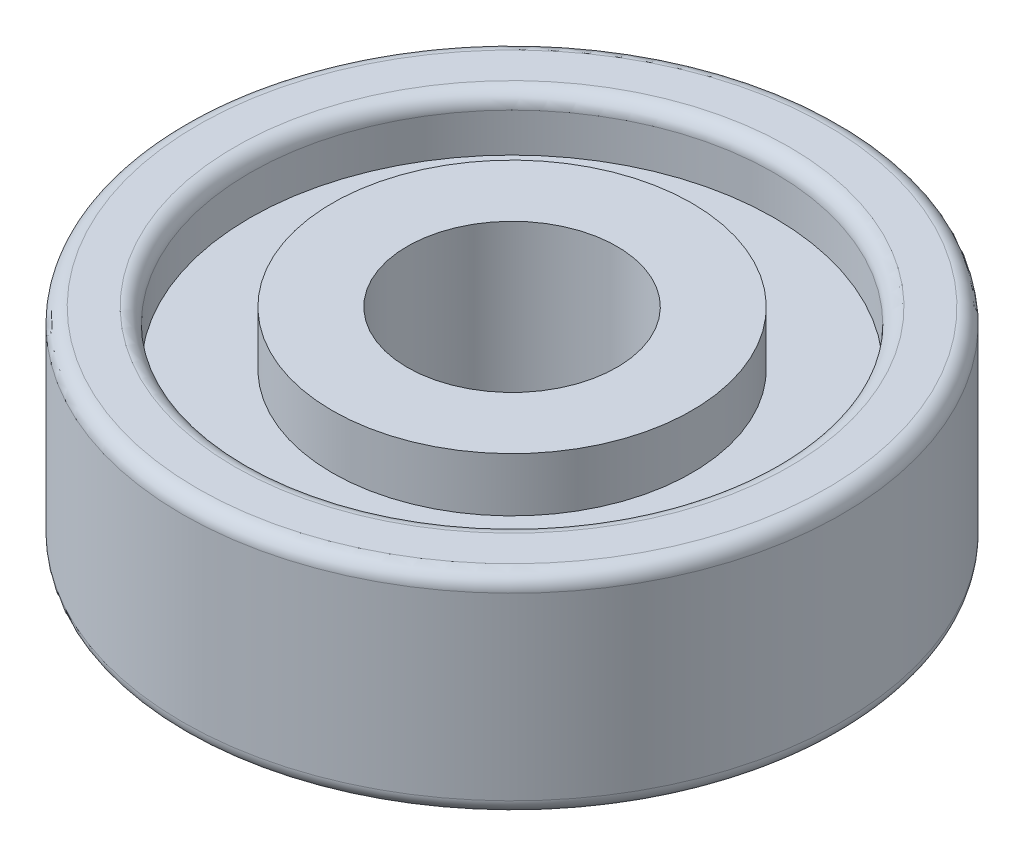
ISO-10303-21;
HEADER;
FILE_DESCRIPTION(('STEP AP214'),'2;1');
FILE_NAME('part.step','',(''),(''),'','','');
FILE_SCHEMA(('AUTOMOTIVE_DESIGN { 1 0 10303 214 1 1 1 1 }'));
ENDSEC;
DATA;
#1=APPLICATION_CONTEXT('core data for automotive mechanical design processes');
#2=APPLICATION_PROTOCOL_DEFINITION('international standard','automotive_design',2000,#1);
#3=PRODUCT_CONTEXT('',#1,'mechanical');
#4=PRODUCT('Part','Part','',(#3));
#5=PRODUCT_RELATED_PRODUCT_CATEGORY('part','',(#4));
#6=PRODUCT_DEFINITION_FORMATION('','',#4);
#7=PRODUCT_DEFINITION_CONTEXT('part definition',#1,'design');
#8=PRODUCT_DEFINITION('design','',#6,#7);
#9=PRODUCT_DEFINITION_SHAPE('','',#8);
#10=(LENGTH_UNIT() NAMED_UNIT(*) SI_UNIT(.MILLI.,.METRE.));
#11=(NAMED_UNIT(*) PLANE_ANGLE_UNIT() SI_UNIT($,.RADIAN.));
#12=(NAMED_UNIT(*) SI_UNIT($,.STERADIAN.) SOLID_ANGLE_UNIT());
#13=UNCERTAINTY_MEASURE_WITH_UNIT(LENGTH_MEASURE(1.E-05),#10,'distance_accuracy_value','');
#14=(GEOMETRIC_REPRESENTATION_CONTEXT(3) GLOBAL_UNCERTAINTY_ASSIGNED_CONTEXT((#13)) GLOBAL_UNIT_ASSIGNED_CONTEXT((#10,
#11,#12)) REPRESENTATION_CONTEXT('',''));
#15=CARTESIAN_POINT('',(0.,0.,0.));
#16=DIRECTION('',(0.,0.,1.));
#17=DIRECTION('',(1.,0.,0.));
#18=AXIS2_PLACEMENT_3D('',#15,#16,#17);
#19=CARTESIAN_POINT('',(0.,-3.5,0.));
#20=DIRECTION('',(0.,1.,0.));
#21=DIRECTION('',(0.,0.,1.));
#22=AXIS2_PLACEMENT_3D('',#19,#20,#21);
#23=PLANE('',#22);
#24=CARTESIAN_POINT('',(0.,-3.5,0.));
#25=DIRECTION('',(0.,1.,0.));
#26=DIRECTION('',(0.,0.,1.));
#27=AXIS2_PLACEMENT_3D('',#24,#25,#26);
#28=CIRCLE('',#27,3.5);
#29=CARTESIAN_POINT('',(0.,-3.5,3.5));
#30=VERTEX_POINT('',#29);
#31=EDGE_CURVE('E93',#30,#30,#28,.T.);
#32=ORIENTED_EDGE('',*,*,#31,.T.);
#33=EDGE_LOOP('',(#32));
#34=FACE_BOUND('',#33,.T.);
#35=CARTESIAN_POINT('',(0.,-3.5,0.));
#36=DIRECTION('',(0.,1.,0.));
#37=DIRECTION('',(0.,0.,1.));
#38=AXIS2_PLACEMENT_3D('',#35,#36,#37);
#39=CIRCLE('',#38,6.);
#40=CARTESIAN_POINT('',(0.,-3.5,6.));
#41=VERTEX_POINT('',#40);
#42=EDGE_CURVE('E118',#41,#41,#39,.T.);
#43=ORIENTED_EDGE('',*,*,#42,.F.);
#44=EDGE_LOOP('',(#43));
#45=FACE_BOUND('',#44,.T.);
#46=ADVANCED_FACE('F53',(#34,#45),#23,.F.);
#47=CARTESIAN_POINT('',(0.,3.5,0.));
#48=DIRECTION('',(0.,1.,0.));
#49=DIRECTION('',(0.,0.,1.));
#50=AXIS2_PLACEMENT_3D('',#47,#48,#49);
#51=PLANE('',#50);
#52=CARTESIAN_POINT('',(0.,3.5,0.));
#53=DIRECTION('',(0.,1.,0.));
#54=DIRECTION('',(0.,0.,1.));
#55=AXIS2_PLACEMENT_3D('',#52,#53,#54);
#56=CIRCLE('',#55,3.5);
#57=CARTESIAN_POINT('',(0.,3.5,3.5));
#58=VERTEX_POINT('',#57);
#59=EDGE_CURVE('E94',#58,#58,#56,.T.);
#60=ORIENTED_EDGE('',*,*,#59,.F.);
#61=EDGE_LOOP('',(#60));
#62=FACE_BOUND('',#61,.T.);
#63=CARTESIAN_POINT('',(0.,3.5,0.));
#64=DIRECTION('',(0.,1.,0.));
#65=DIRECTION('',(0.,0.,1.));
#66=AXIS2_PLACEMENT_3D('',#63,#64,#65);
#67=CIRCLE('',#66,6.);
#68=CARTESIAN_POINT('',(0.,3.5,6.));
#69=VERTEX_POINT('',#68);
#70=EDGE_CURVE('E106',#69,#69,#67,.T.);
#71=ORIENTED_EDGE('',*,*,#70,.T.);
#72=EDGE_LOOP('',(#71));
#73=FACE_BOUND('',#72,.T.);
#74=ADVANCED_FACE('F137',(#62,#73),#51,.T.);
#75=CARTESIAN_POINT('',(0.,3.5,0.));
#76=DIRECTION('',(0.,-1.,0.));
#77=DIRECTION('',(0.,0.,-1.));
#78=AXIS2_PLACEMENT_3D('',#75,#76,#77);
#79=CYLINDRICAL_SURFACE('',#78,11.);
#80=CARTESIAN_POINT('',(0.,3.,0.));
#81=DIRECTION('',(0.,1.,0.));
#82=DIRECTION('',(0.,0.,1.));
#83=AXIS2_PLACEMENT_3D('',#80,#81,#82);
#84=CIRCLE('',#83,11.);
#85=CARTESIAN_POINT('',(0.,3.,11.));
#86=VERTEX_POINT('',#85);
#87=EDGE_CURVE('E77',#86,#86,#84,.F.);
#88=ORIENTED_EDGE('',*,*,#87,.T.);
#89=EDGE_LOOP('',(#88));
#90=FACE_BOUND('',#89,.T.);
#91=CARTESIAN_POINT('',(0.,-3.,0.));
#92=DIRECTION('',(0.,1.,0.));
#93=DIRECTION('',(0.,0.,1.));
#94=AXIS2_PLACEMENT_3D('',#91,#92,#93);
#95=CIRCLE('',#94,11.);
#96=CARTESIAN_POINT('',(0.,-3.,11.));
#97=VERTEX_POINT('',#96);
#98=EDGE_CURVE('E81',#97,#97,#95,.T.);
#99=ORIENTED_EDGE('',*,*,#98,.T.);
#100=EDGE_LOOP('',(#99));
#101=FACE_BOUND('',#100,.T.);
#102=ADVANCED_FACE('F144',(#90,#101),#79,.T.);
#103=CARTESIAN_POINT('',(0.,3.5,0.));
#104=DIRECTION('',(0.,1.,0.));
#105=DIRECTION('',(0.,0.,1.));
#106=AXIS2_PLACEMENT_3D('',#103,#104,#105);
#107=CIRCLE('',#106,10.5);
#108=CARTESIAN_POINT('',(0.,3.5,10.5));
#109=VERTEX_POINT('',#108);
#110=EDGE_CURVE('E85',#109,#109,#107,.T.);
#111=ORIENTED_EDGE('',*,*,#110,.T.);
#112=EDGE_LOOP('',(#111));
#113=FACE_BOUND('',#112,.T.);
#114=CARTESIAN_POINT('',(0.,3.5,0.));
#115=DIRECTION('',(0.,1.,0.));
#116=DIRECTION('',(0.,0.,1.));
#117=AXIS2_PLACEMENT_3D('',#114,#115,#116);
#118=CIRCLE('',#117,9.25);
#119=CARTESIAN_POINT('',(0.,3.5,9.25));
#120=VERTEX_POINT('',#119);
#121=EDGE_CURVE('E89',#120,#120,#118,.F.);
#122=ORIENTED_EDGE('',*,*,#121,.T.);
#123=EDGE_LOOP('',(#122));
#124=FACE_BOUND('',#123,.T.);
#125=ADVANCED_FACE('F147',(#113,#124),#51,.T.);
#126=CARTESIAN_POINT('',(0.,-3.5,0.));
#127=DIRECTION('',(0.,1.,0.));
#128=DIRECTION('',(0.,0.,1.));
#129=AXIS2_PLACEMENT_3D('',#126,#127,#128);
#130=CIRCLE('',#129,10.5);
#131=CARTESIAN_POINT('',(0.,-3.5,10.5));
#132=VERTEX_POINT('',#131);
#133=EDGE_CURVE('E61',#132,#132,#130,.F.);
#134=ORIENTED_EDGE('',*,*,#133,.T.);
#135=EDGE_LOOP('',(#134));
#136=FACE_BOUND('',#135,.T.);
#137=CARTESIAN_POINT('',(0.,-3.5,0.));
#138=DIRECTION('',(0.,1.,0.));
#139=DIRECTION('',(0.,0.,1.));
#140=AXIS2_PLACEMENT_3D('',#137,#138,#139);
#141=CIRCLE('',#140,9.25);
#142=CARTESIAN_POINT('',(0.,-3.5,9.25));
#143=VERTEX_POINT('',#142);
#144=EDGE_CURVE('E66',#143,#143,#141,.T.);
#145=ORIENTED_EDGE('',*,*,#144,.T.);
#146=EDGE_LOOP('',(#145));
#147=FACE_BOUND('',#146,.T.);
#148=ADVANCED_FACE('F140',(#136,#147),#23,.F.);
#149=CARTESIAN_POINT('',(0.,-3.5,0.));
#150=DIRECTION('',(0.,1.,0.));
#151=DIRECTION('',(0.,0.,1.));
#152=AXIS2_PLACEMENT_3D('',#149,#150,#151);
#153=CYLINDRICAL_SURFACE('',#152,3.5);
#154=ORIENTED_EDGE('',*,*,#31,.F.);
#155=EDGE_LOOP('',(#154));
#156=FACE_BOUND('',#155,.T.);
#157=ORIENTED_EDGE('',*,*,#59,.T.);
#158=EDGE_LOOP('',(#157));
#159=FACE_BOUND('',#158,.T.);
#160=ADVANCED_FACE('F150',(#156,#159),#153,.F.);
#161=CARTESIAN_POINT('',(0.,1.7,0.));
#162=DIRECTION('',(0.,1.,0.));
#163=DIRECTION('',(0.,0.,1.));
#164=AXIS2_PLACEMENT_3D('',#161,#162,#163);
#165=CYLINDRICAL_SURFACE('',#164,8.75);
#166=CARTESIAN_POINT('',(0.,3.,0.));
#167=DIRECTION('',(0.,1.,0.));
#168=DIRECTION('',(0.,0.,1.));
#169=AXIS2_PLACEMENT_3D('',#166,#167,#168);
#170=CIRCLE('',#169,8.75);
#171=CARTESIAN_POINT('',(0.,3.,8.75));
#172=VERTEX_POINT('',#171);
#173=EDGE_CURVE('E71',#172,#172,#170,.T.);
#174=ORIENTED_EDGE('',*,*,#173,.T.);
#175=EDGE_LOOP('',(#174));
#176=FACE_BOUND('',#175,.T.);
#177=CARTESIAN_POINT('',(0.,1.7,0.));
#178=DIRECTION('',(0.,1.,0.));
#179=DIRECTION('',(0.,0.,1.));
#180=AXIS2_PLACEMENT_3D('',#177,#178,#179);
#181=CIRCLE('',#180,8.75);
#182=CARTESIAN_POINT('',(0.,1.7,8.75));
#183=VERTEX_POINT('',#182);
#184=EDGE_CURVE('E98',#183,#183,#181,.T.);
#185=ORIENTED_EDGE('',*,*,#184,.F.);
#186=EDGE_LOOP('',(#185));
#187=FACE_BOUND('',#186,.T.);
#188=ADVANCED_FACE('F155',(#176,#187),#165,.F.);
#189=CARTESIAN_POINT('',(0.,1.7,0.));
#190=DIRECTION('',(0.,1.,0.));
#191=DIRECTION('',(0.,0.,1.));
#192=AXIS2_PLACEMENT_3D('',#189,#190,#191);
#193=PLANE('',#192);
#194=CARTESIAN_POINT('',(0.,1.7,0.));
#195=DIRECTION('',(0.,1.,0.));
#196=DIRECTION('',(0.,0.,1.));
#197=AXIS2_PLACEMENT_3D('',#194,#195,#196);
#198=CIRCLE('',#197,6.);
#199=CARTESIAN_POINT('',(0.,1.7,6.));
#200=VERTEX_POINT('',#199);
#201=EDGE_CURVE('E105',#200,#200,#198,.T.);
#202=ORIENTED_EDGE('',*,*,#201,.F.);
#203=EDGE_LOOP('',(#202));
#204=FACE_BOUND('',#203,.T.);
#205=ORIENTED_EDGE('',*,*,#184,.T.);
#206=EDGE_LOOP('',(#205));
#207=FACE_BOUND('',#206,.T.);
#208=ADVANCED_FACE('F195',(#204,#207),#193,.T.);
#209=CARTESIAN_POINT('',(0.,1.7,0.));
#210=DIRECTION('',(0.,1.,0.));
#211=DIRECTION('',(0.,0.,1.));
#212=AXIS2_PLACEMENT_3D('',#209,#210,#211);
#213=CYLINDRICAL_SURFACE('',#212,6.);
#214=ORIENTED_EDGE('',*,*,#201,.T.);
#215=EDGE_LOOP('',(#214));
#216=FACE_BOUND('',#215,.T.);
#217=ORIENTED_EDGE('',*,*,#70,.F.);
#218=EDGE_LOOP('',(#217));
#219=FACE_BOUND('',#218,.T.);
#220=ADVANCED_FACE('F200',(#216,#219),#213,.T.);
#221=CARTESIAN_POINT('',(0.,-1.7,0.));
#222=DIRECTION('',(0.,-1.,0.));
#223=DIRECTION('',(0.,0.,1.));
#224=AXIS2_PLACEMENT_3D('',#221,#222,#223);
#225=PLANE('',#224);
#226=CARTESIAN_POINT('',(0.,-1.7,0.));
#227=DIRECTION('',(0.,1.,0.));
#228=DIRECTION('',(0.,0.,1.));
#229=AXIS2_PLACEMENT_3D('',#226,#227,#228);
#230=CIRCLE('',#229,8.75);
#231=CARTESIAN_POINT('',(0.,-1.7,8.75));
#232=VERTEX_POINT('',#231);
#233=EDGE_CURVE('E110',#232,#232,#230,.T.);
#234=ORIENTED_EDGE('',*,*,#233,.F.);
#235=EDGE_LOOP('',(#234));
#236=FACE_BOUND('',#235,.T.);
#237=CARTESIAN_POINT('',(0.,-1.7,0.));
#238=DIRECTION('',(0.,1.,0.));
#239=DIRECTION('',(0.,0.,1.));
#240=AXIS2_PLACEMENT_3D('',#237,#238,#239);
#241=CIRCLE('',#240,6.);
#242=CARTESIAN_POINT('',(0.,-1.7,6.));
#243=VERTEX_POINT('',#242);
#244=EDGE_CURVE('E117',#243,#243,#241,.T.);
#245=ORIENTED_EDGE('',*,*,#244,.T.);
#246=EDGE_LOOP('',(#245));
#247=FACE_BOUND('',#246,.T.);
#248=ADVANCED_FACE('F126',(#236,#247),#225,.T.);
#249=CARTESIAN_POINT('',(0.,-1.7,0.));
#250=DIRECTION('',(0.,-1.,0.));
#251=DIRECTION('',(0.,0.,-1.));
#252=AXIS2_PLACEMENT_3D('',#249,#250,#251);
#253=CYLINDRICAL_SURFACE('',#252,8.75);
#254=CARTESIAN_POINT('',(0.,-3.,0.));
#255=DIRECTION('',(0.,1.,0.));
#256=DIRECTION('',(0.,0.,1.));
#257=AXIS2_PLACEMENT_3D('',#254,#255,#256);
#258=CIRCLE('',#257,8.75);
#259=CARTESIAN_POINT('',(0.,-3.,8.75));
#260=VERTEX_POINT('',#259);
#261=EDGE_CURVE('E11',#260,#260,#258,.F.);
#262=ORIENTED_EDGE('',*,*,#261,.T.);
#263=EDGE_LOOP('',(#262));
#264=FACE_BOUND('',#263,.T.);
#265=ORIENTED_EDGE('',*,*,#233,.T.);
#266=EDGE_LOOP('',(#265));
#267=FACE_BOUND('',#266,.T.);
#268=ADVANCED_FACE('F132',(#264,#267),#253,.F.);
#269=CARTESIAN_POINT('',(0.,-1.7,0.));
#270=DIRECTION('',(0.,-1.,0.));
#271=DIRECTION('',(0.,0.,-1.));
#272=AXIS2_PLACEMENT_3D('',#269,#270,#271);
#273=CYLINDRICAL_SURFACE('',#272,6.);
#274=ORIENTED_EDGE('',*,*,#244,.F.);
#275=EDGE_LOOP('',(#274));
#276=FACE_BOUND('',#275,.T.);
#277=ORIENTED_EDGE('',*,*,#42,.T.);
#278=EDGE_LOOP('',(#277));
#279=FACE_BOUND('',#278,.T.);
#280=ADVANCED_FACE('F128',(#276,#279),#273,.T.);
#281=CARTESIAN_POINT('',(0.,3.,0.));
#282=DIRECTION('',(0.,1.,0.));
#283=DIRECTION('',(0.,0.,1.));
#284=AXIS2_PLACEMENT_3D('',#281,#282,#283);
#285=TOROIDAL_SURFACE('',#284,10.5,0.5);
#286=ORIENTED_EDGE('',*,*,#87,.F.);
#287=EDGE_LOOP('',(#286));
#288=FACE_BOUND('',#287,.T.);
#289=ORIENTED_EDGE('',*,*,#110,.F.);
#290=EDGE_LOOP('',(#289));
#291=FACE_BOUND('',#290,.T.);
#292=ADVANCED_FACE('F131',(#288,#291),#285,.T.);
#293=CARTESIAN_POINT('',(0.,3.,0.));
#294=DIRECTION('',(0.,1.,0.));
#295=DIRECTION('',(0.,0.,1.));
#296=AXIS2_PLACEMENT_3D('',#293,#294,#295);
#297=TOROIDAL_SURFACE('',#296,9.25,0.5);
#298=ORIENTED_EDGE('',*,*,#121,.F.);
#299=EDGE_LOOP('',(#298));
#300=FACE_BOUND('',#299,.T.);
#301=ORIENTED_EDGE('',*,*,#173,.F.);
#302=EDGE_LOOP('',(#301));
#303=FACE_BOUND('',#302,.T.);
#304=ADVANCED_FACE('F168',(#300,#303),#297,.T.);
#305=CARTESIAN_POINT('',(0.,-3.,0.));
#306=DIRECTION('',(0.,1.,0.));
#307=DIRECTION('',(0.,0.,1.));
#308=AXIS2_PLACEMENT_3D('',#305,#306,#307);
#309=TOROIDAL_SURFACE('',#308,10.5,0.5);
#310=ORIENTED_EDGE('',*,*,#133,.F.);
#311=EDGE_LOOP('',(#310));
#312=FACE_BOUND('',#311,.T.);
#313=ORIENTED_EDGE('',*,*,#98,.F.);
#314=EDGE_LOOP('',(#313));
#315=FACE_BOUND('',#314,.T.);
#316=ADVANCED_FACE('F163',(#312,#315),#309,.T.);
#317=CARTESIAN_POINT('',(0.,-3.,0.));
#318=DIRECTION('',(0.,1.,0.));
#319=DIRECTION('',(0.,0.,1.));
#320=AXIS2_PLACEMENT_3D('',#317,#318,#319);
#321=TOROIDAL_SURFACE('',#320,9.25,0.5);
#322=ORIENTED_EDGE('',*,*,#261,.F.);
#323=EDGE_LOOP('',(#322));
#324=FACE_BOUND('',#323,.T.);
#325=ORIENTED_EDGE('',*,*,#144,.F.);
#326=EDGE_LOOP('',(#325));
#327=FACE_BOUND('',#326,.T.);
#328=ADVANCED_FACE('F55',(#324,#327),#321,.T.);
#329=CLOSED_SHELL('',(#46,#74,#102,#125,#148,#160,#188,#208,#220,#248,#268,#280,#292,#304,#316,#328));
#330=MANIFOLD_SOLID_BREP('B2',#329);
#331=ADVANCED_BREP_SHAPE_REPRESENTATION('',(#18,#330),#14);
#332=SHAPE_DEFINITION_REPRESENTATION(#9,#331);
ENDSEC;
END-ISO-10303-21;
